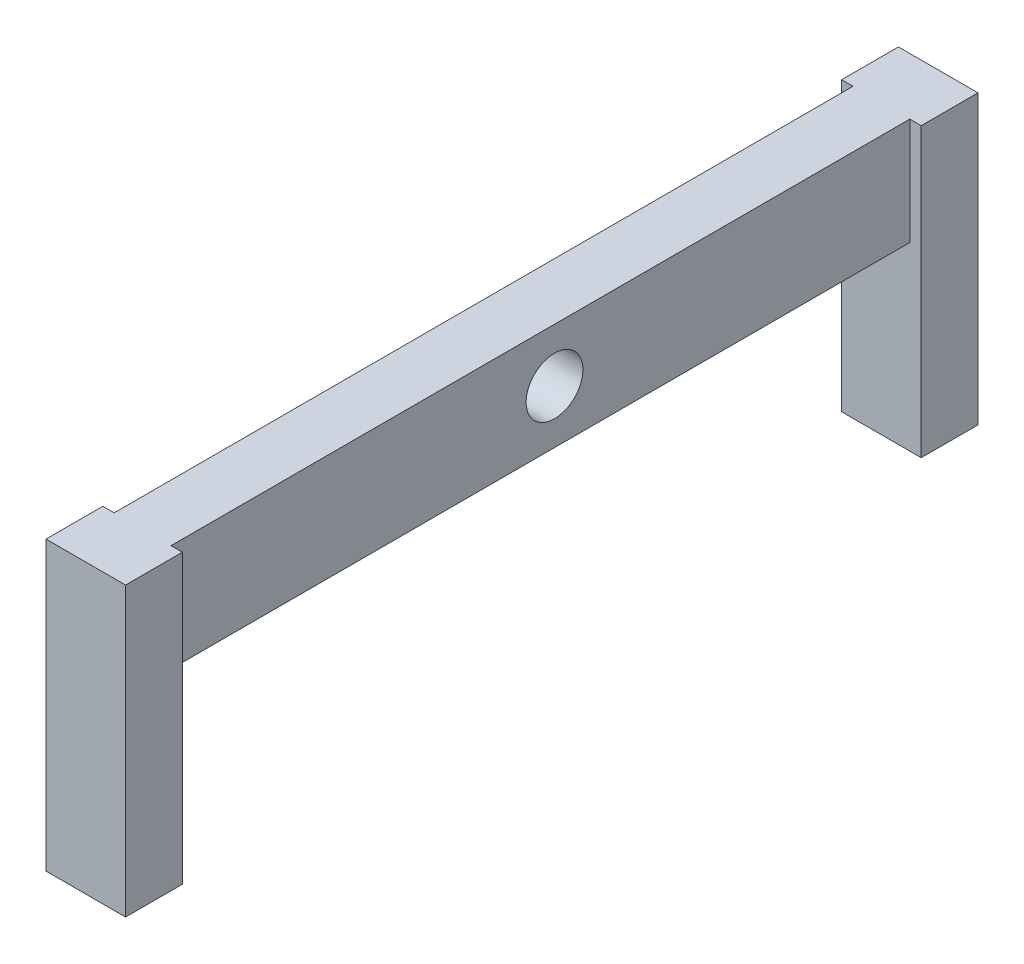
ISO-10303-21;
HEADER;
FILE_DESCRIPTION(('STEP AP214'),'2;1');
FILE_NAME('part.step','',(''),(''),'','','');
FILE_SCHEMA(('AUTOMOTIVE_DESIGN { 1 0 10303 214 1 1 1 1 }'));
ENDSEC;
DATA;
#1=APPLICATION_CONTEXT('core data for automotive mechanical design processes');
#2=APPLICATION_PROTOCOL_DEFINITION('international standard','automotive_design',2000,#1);
#3=PRODUCT_CONTEXT('',#1,'mechanical');
#4=PRODUCT('Part','Part','',(#3));
#5=PRODUCT_RELATED_PRODUCT_CATEGORY('part','',(#4));
#6=PRODUCT_DEFINITION_FORMATION('','',#4);
#7=PRODUCT_DEFINITION_CONTEXT('part definition',#1,'design');
#8=PRODUCT_DEFINITION('design','',#6,#7);
#9=PRODUCT_DEFINITION_SHAPE('','',#8);
#10=(LENGTH_UNIT() NAMED_UNIT(*) SI_UNIT(.MILLI.,.METRE.));
#11=(NAMED_UNIT(*) PLANE_ANGLE_UNIT() SI_UNIT($,.RADIAN.));
#12=(NAMED_UNIT(*) SI_UNIT($,.STERADIAN.) SOLID_ANGLE_UNIT());
#13=UNCERTAINTY_MEASURE_WITH_UNIT(LENGTH_MEASURE(1.E-05),#10,'distance_accuracy_value','');
#14=(GEOMETRIC_REPRESENTATION_CONTEXT(3) GLOBAL_UNCERTAINTY_ASSIGNED_CONTEXT((#13)) GLOBAL_UNIT_ASSIGNED_CONTEXT((#10,
#11,#12)) REPRESENTATION_CONTEXT('',''));
#15=CARTESIAN_POINT('',(0.,0.,0.));
#16=DIRECTION('',(0.,0.,1.));
#17=DIRECTION('',(1.,0.,0.));
#18=AXIS2_PLACEMENT_3D('',#15,#16,#17);
#19=CARTESIAN_POINT('',(-474.137931034483,94.,-241.163793103448));
#20=DIRECTION('',(1.,0.,0.));
#21=DIRECTION('',(0.,0.,-1.));
#22=AXIS2_PLACEMENT_3D('',#19,#20,#21);
#23=PLANE('',#22);
#24=CARTESIAN_POINT('',(-474.137931034483,47.,121.436206896552));
#25=DIRECTION('',(1.,0.,0.));
#26=DIRECTION('',(0.,0.,-1.));
#27=AXIS2_PLACEMENT_3D('',#24,#25,#26);
#28=CIRCLE('',#27,25.);
#29=CARTESIAN_POINT('',(-474.137931034483,47.,96.4362068965518));
#30=VERTEX_POINT('',#29);
#31=EDGE_CURVE('E282',#30,#30,#28,.T.);
#32=ORIENTED_EDGE('',*,*,#31,.T.);
#33=EDGE_LOOP('',(#32));
#34=FACE_BOUND('',#33,.T.);
#35=CARTESIAN_POINT('',(-474.137931034483,47.,405.336206896552));
#36=DIRECTION('',(-1.,0.,0.));
#37=DIRECTION('',(0.,0.,1.));
#38=AXIS2_PLACEMENT_3D('',#35,#36,#37);
#39=CIRCLE('',#38,20.);
#40=CARTESIAN_POINT('',(-474.137931034483,47.,425.336206896552));
#41=VERTEX_POINT('',#40);
#42=EDGE_CURVE('E286',#41,#41,#39,.T.);
#43=ORIENTED_EDGE('',*,*,#42,.F.);
#44=EDGE_LOOP('',(#43));
#45=FACE_BOUND('',#44,.T.);
#46=CARTESIAN_POINT('',(-474.137931034483,47.,-137.663793103448));
#47=DIRECTION('',(-1.,0.,0.));
#48=DIRECTION('',(0.,0.,1.));
#49=AXIS2_PLACEMENT_3D('',#46,#47,#48);
#50=CIRCLE('',#49,20.);
#51=CARTESIAN_POINT('',(-474.137931034483,47.,-117.663793103448));
#52=VERTEX_POINT('',#51);
#53=EDGE_CURVE('E289',#52,#52,#50,.T.);
#54=ORIENTED_EDGE('',*,*,#53,.F.);
#55=EDGE_LOOP('',(#54));
#56=FACE_BOUND('',#55,.T.);
#57=DIRECTION('',(0.,1.,0.));
#58=VECTOR('',#57,1.);
#59=CARTESIAN_POINT('',(-474.137931034483,94.,-191.163793103448));
#60=LINE('',#59,#58);
#61=CARTESIAN_POINT('',(-474.137931034483,0.,-191.163793103448));
#62=VERTEX_POINT('',#61);
#63=CARTESIAN_POINT('',(-474.137931034483,94.,-191.163793103448));
#64=VERTEX_POINT('',#63);
#65=EDGE_CURVE('E210',#62,#64,#60,.T.);
#66=ORIENTED_EDGE('',*,*,#65,.F.);
#67=DIRECTION('',(0.,0.,1.));
#68=VECTOR('',#67,1.);
#69=CARTESIAN_POINT('',(-474.137931034483,0.,-241.163793103448));
#70=LINE('',#69,#68);
#71=CARTESIAN_POINT('',(-474.137931034483,0.,458.836206896552));
#72=VERTEX_POINT('',#71);
#73=EDGE_CURVE('E212',#62,#72,#70,.T.);
#74=ORIENTED_EDGE('',*,*,#73,.T.);
#75=DIRECTION('',(0.,1.,0.));
#76=VECTOR('',#75,1.);
#77=CARTESIAN_POINT('',(-474.137931034483,94.,458.836206896552));
#78=LINE('',#77,#76);
#79=CARTESIAN_POINT('',(-474.137931034483,94.,458.836206896552));
#80=VERTEX_POINT('',#79);
#81=EDGE_CURVE('E56',#72,#80,#78,.T.);
#82=ORIENTED_EDGE('',*,*,#81,.T.);
#83=DIRECTION('',(0.,0.,1.));
#84=VECTOR('',#83,1.);
#85=CARTESIAN_POINT('',(-474.137931034483,94.,-241.163793103448));
#86=LINE('',#85,#84);
#87=EDGE_CURVE('E213',#64,#80,#86,.T.);
#88=ORIENTED_EDGE('',*,*,#87,.F.);
#89=EDGE_LOOP('',(#66,#74,#82,#88));
#90=FACE_BOUND('',#89,.T.);
#91=ADVANCED_FACE('F41',(#34,#45,#56,#90),#23,.F.);
#92=CARTESIAN_POINT('',(-424.137931034483,94.,-241.163793103448));
#93=DIRECTION('',(-1.,0.,0.));
#94=DIRECTION('',(0.,0.,1.));
#95=AXIS2_PLACEMENT_3D('',#92,#93,#94);
#96=PLANE('',#95);
#97=CARTESIAN_POINT('',(-424.137931034483,47.,121.436206896552));
#98=DIRECTION('',(-1.,0.,0.));
#99=DIRECTION('',(0.,0.,1.));
#100=AXIS2_PLACEMENT_3D('',#97,#98,#99);
#101=CIRCLE('',#100,25.);
#102=CARTESIAN_POINT('',(-424.137931034483,47.,146.436206896552));
#103=VERTEX_POINT('',#102);
#104=EDGE_CURVE('E44',#103,#103,#101,.T.);
#105=ORIENTED_EDGE('',*,*,#104,.T.);
#106=EDGE_LOOP('',(#105));
#107=FACE_BOUND('',#106,.T.);
#108=DIRECTION('',(0.,-1.,0.));
#109=VECTOR('',#108,1.);
#110=CARTESIAN_POINT('',(-424.137931034483,94.,-191.163793103448));
#111=LINE('',#110,#109);
#112=CARTESIAN_POINT('',(-424.137931034483,94.,-191.163793103448));
#113=VERTEX_POINT('',#112);
#114=CARTESIAN_POINT('',(-424.137931034483,0.,-191.163793103448));
#115=VERTEX_POINT('',#114);
#116=EDGE_CURVE('E208',#113,#115,#111,.T.);
#117=ORIENTED_EDGE('',*,*,#116,.F.);
#118=DIRECTION('',(0.,0.,-1.));
#119=VECTOR('',#118,1.);
#120=CARTESIAN_POINT('',(-424.137931034483,94.,-241.163793103448));
#121=LINE('',#120,#119);
#122=CARTESIAN_POINT('',(-424.137931034483,94.,458.836206896552));
#123=VERTEX_POINT('',#122);
#124=EDGE_CURVE('E219',#123,#113,#121,.T.);
#125=ORIENTED_EDGE('',*,*,#124,.F.);
#126=DIRECTION('',(0.,-1.,0.));
#127=VECTOR('',#126,1.);
#128=CARTESIAN_POINT('',(-424.137931034483,94.,458.836206896552));
#129=LINE('',#128,#127);
#130=CARTESIAN_POINT('',(-424.137931034483,0.,458.836206896552));
#131=VERTEX_POINT('',#130);
#132=EDGE_CURVE('E167',#123,#131,#129,.T.);
#133=ORIENTED_EDGE('',*,*,#132,.T.);
#134=DIRECTION('',(0.,0.,-1.));
#135=VECTOR('',#134,1.);
#136=CARTESIAN_POINT('',(-424.137931034483,0.,-241.163793103448));
#137=LINE('',#136,#135);
#138=EDGE_CURVE('E217',#131,#115,#137,.T.);
#139=ORIENTED_EDGE('',*,*,#138,.T.);
#140=EDGE_LOOP('',(#117,#125,#133,#139));
#141=FACE_BOUND('',#140,.T.);
#142=ADVANCED_FACE('F246',(#107,#141),#96,.F.);
#143=CARTESIAN_POINT('',(0.,0.,0.));
#144=DIRECTION('',(0.,1.,0.));
#145=DIRECTION('',(0.,0.,1.));
#146=AXIS2_PLACEMENT_3D('',#143,#144,#145);
#147=PLANE('',#146);
#148=DIRECTION('',(-1.,0.,0.));
#149=VECTOR('',#148,1.);
#150=CARTESIAN_POINT('',(0.,0.,-191.163793103448));
#151=LINE('',#150,#149);
#152=EDGE_CURVE('E11',#115,#62,#151,.T.);
#153=ORIENTED_EDGE('',*,*,#152,.F.);
#154=ORIENTED_EDGE('',*,*,#138,.F.);
#155=DIRECTION('',(-1.,0.,0.));
#156=VECTOR('',#155,1.);
#157=CARTESIAN_POINT('',(-7.27729316326035E-13,0.,458.836206896552));
#158=LINE('',#157,#156);
#159=EDGE_CURVE('E49',#131,#72,#158,.T.);
#160=ORIENTED_EDGE('',*,*,#159,.T.);
#161=ORIENTED_EDGE('',*,*,#73,.F.);
#162=EDGE_LOOP('',(#153,#154,#160,#161));
#163=FACE_BOUND('',#162,.T.);
#164=ADVANCED_FACE('F231',(#163),#147,.F.);
#165=CARTESIAN_POINT('',(-474.137931034483,94.,508.836206896552));
#166=DIRECTION('',(0.,0.,-1.));
#167=DIRECTION('',(-1.,0.,0.));
#168=AXIS2_PLACEMENT_3D('',#165,#166,#167);
#169=PLANE('',#168);
#170=DIRECTION('',(1.,0.,0.));
#171=VECTOR('',#170,1.);
#172=CARTESIAN_POINT('',(-474.137931034483,94.,508.836206896552));
#173=LINE('',#172,#171);
#174=CARTESIAN_POINT('',(-484.137931034484,94.,508.836206896552));
#175=VERTEX_POINT('',#174);
#176=CARTESIAN_POINT('',(-414.137931034484,94.,508.836206896552));
#177=VERTEX_POINT('',#176);
#178=EDGE_CURVE('E216',#175,#177,#173,.T.);
#179=ORIENTED_EDGE('',*,*,#178,.F.);
#180=DIRECTION('',(0.,1.,0.));
#181=VECTOR('',#180,1.);
#182=CARTESIAN_POINT('',(-484.137931034484,-159.,508.836206896552));
#183=LINE('',#182,#181);
#184=CARTESIAN_POINT('',(-484.137931034484,-159.,508.836206896552));
#185=VERTEX_POINT('',#184);
#186=EDGE_CURVE('E195',#185,#175,#183,.T.);
#187=ORIENTED_EDGE('',*,*,#186,.F.);
#188=DIRECTION('',(-1.,0.,0.));
#189=VECTOR('',#188,1.);
#190=CARTESIAN_POINT('',(0.,-159.,508.836206896552));
#191=LINE('',#190,#189);
#192=CARTESIAN_POINT('',(-414.137931034484,-159.,508.836206896552));
#193=VERTEX_POINT('',#192);
#194=EDGE_CURVE('E172',#193,#185,#191,.T.);
#195=ORIENTED_EDGE('',*,*,#194,.F.);
#196=DIRECTION('',(0.,1.,0.));
#197=VECTOR('',#196,1.);
#198=CARTESIAN_POINT('',(-414.137931034484,-159.,508.836206896552));
#199=LINE('',#198,#197);
#200=EDGE_CURVE('E184',#193,#177,#199,.T.);
#201=ORIENTED_EDGE('',*,*,#200,.T.);
#202=EDGE_LOOP('',(#179,#187,#195,#201));
#203=FACE_BOUND('',#202,.T.);
#204=ADVANCED_FACE('F263',(#203),#169,.F.);
#205=CARTESIAN_POINT('',(-474.137931034483,94.,-241.163793103448));
#206=DIRECTION('',(0.,0.,1.));
#207=DIRECTION('',(1.,0.,0.));
#208=AXIS2_PLACEMENT_3D('',#205,#206,#207);
#209=PLANE('',#208);
#210=DIRECTION('',(-1.,0.,0.));
#211=VECTOR('',#210,1.);
#212=CARTESIAN_POINT('',(-474.137931034483,94.,-241.163793103448));
#213=LINE('',#212,#211);
#214=CARTESIAN_POINT('',(-414.137931034483,94.,-241.163793103448));
#215=VERTEX_POINT('',#214);
#216=CARTESIAN_POINT('',(-484.137931034483,94.,-241.163793103448));
#217=VERTEX_POINT('',#216);
#218=EDGE_CURVE('E222',#215,#217,#213,.T.);
#219=ORIENTED_EDGE('',*,*,#218,.F.);
#220=DIRECTION('',(0.,1.,0.));
#221=VECTOR('',#220,1.);
#222=CARTESIAN_POINT('',(-414.137931034483,-159.,-241.163793103448));
#223=LINE('',#222,#221);
#224=CARTESIAN_POINT('',(-414.137931034483,-159.,-241.163793103448));
#225=VERTEX_POINT('',#224);
#226=EDGE_CURVE('E146',#225,#215,#223,.T.);
#227=ORIENTED_EDGE('',*,*,#226,.F.);
#228=DIRECTION('',(-1.,0.,0.));
#229=VECTOR('',#228,1.);
#230=CARTESIAN_POINT('',(0.,-159.,-241.163793103448));
#231=LINE('',#230,#229);
#232=CARTESIAN_POINT('',(-484.137931034483,-159.,-241.163793103448));
#233=VERTEX_POINT('',#232);
#234=EDGE_CURVE('E136',#225,#233,#231,.T.);
#235=ORIENTED_EDGE('',*,*,#234,.T.);
#236=DIRECTION('',(0.,1.,0.));
#237=VECTOR('',#236,1.);
#238=CARTESIAN_POINT('',(-484.137931034483,-159.,-241.163793103448));
#239=LINE('',#238,#237);
#240=EDGE_CURVE('E168',#233,#217,#239,.T.);
#241=ORIENTED_EDGE('',*,*,#240,.T.);
#242=EDGE_LOOP('',(#219,#227,#235,#241));
#243=FACE_BOUND('',#242,.T.);
#244=ADVANCED_FACE('F242',(#243),#209,.F.);
#245=CARTESIAN_POINT('',(0.,94.,0.));
#246=DIRECTION('',(0.,1.,0.));
#247=DIRECTION('',(0.,0.,1.));
#248=AXIS2_PLACEMENT_3D('',#245,#246,#247);
#249=PLANE('',#248);
#250=ORIENTED_EDGE('',*,*,#218,.T.);
#251=DIRECTION('',(0.,0.,-1.));
#252=VECTOR('',#251,1.);
#253=CARTESIAN_POINT('',(-484.137931034483,94.,0.));
#254=LINE('',#253,#252);
#255=CARTESIAN_POINT('',(-484.137931034483,94.,-191.163793103448));
#256=VERTEX_POINT('',#255);
#257=EDGE_CURVE('E152',#256,#217,#254,.T.);
#258=ORIENTED_EDGE('',*,*,#257,.F.);
#259=DIRECTION('',(-1.,0.,0.));
#260=VECTOR('',#259,1.);
#261=CARTESIAN_POINT('',(0.,94.,-191.163793103448));
#262=LINE('',#261,#260);
#263=EDGE_CURVE('E164',#64,#256,#262,.T.);
#264=ORIENTED_EDGE('',*,*,#263,.F.);
#265=ORIENTED_EDGE('',*,*,#87,.T.);
#266=DIRECTION('',(-1.,0.,0.));
#267=VECTOR('',#266,1.);
#268=CARTESIAN_POINT('',(-7.27729316326035E-13,94.,458.836206896552));
#269=LINE('',#268,#267);
#270=CARTESIAN_POINT('',(-484.137931034484,94.,458.836206896552));
#271=VERTEX_POINT('',#270);
#272=EDGE_CURVE('E188',#80,#271,#269,.T.);
#273=ORIENTED_EDGE('',*,*,#272,.T.);
#274=DIRECTION('',(0.,0.,1.));
#275=VECTOR('',#274,1.);
#276=CARTESIAN_POINT('',(-484.137931034483,94.,-1.07500215625774E-12));
#277=LINE('',#276,#275);
#278=EDGE_CURVE('E175',#271,#175,#277,.T.);
#279=ORIENTED_EDGE('',*,*,#278,.T.);
#280=ORIENTED_EDGE('',*,*,#178,.T.);
#281=DIRECTION('',(0.,0.,-1.));
#282=VECTOR('',#281,1.);
#283=CARTESIAN_POINT('',(-414.137931034483,94.,-9.19570932810217E-13));
#284=LINE('',#283,#282);
#285=CARTESIAN_POINT('',(-414.137931034484,94.,458.836206896552));
#286=VERTEX_POINT('',#285);
#287=EDGE_CURVE('E185',#177,#286,#284,.T.);
#288=ORIENTED_EDGE('',*,*,#287,.T.);
#289=EDGE_CURVE('E190',#286,#123,#269,.T.);
#290=ORIENTED_EDGE('',*,*,#289,.T.);
#291=ORIENTED_EDGE('',*,*,#124,.T.);
#292=CARTESIAN_POINT('',(-414.137931034483,94.,-191.163793103448));
#293=VERTEX_POINT('',#292);
#294=EDGE_CURVE('E162',#293,#113,#262,.T.);
#295=ORIENTED_EDGE('',*,*,#294,.F.);
#296=DIRECTION('',(0.,0.,1.));
#297=VECTOR('',#296,1.);
#298=CARTESIAN_POINT('',(-414.137931034483,94.,0.));
#299=LINE('',#298,#297);
#300=EDGE_CURVE('E144',#215,#293,#299,.T.);
#301=ORIENTED_EDGE('',*,*,#300,.F.);
#302=EDGE_LOOP('',(#250,#258,#264,#265,#273,#279,#280,#288,#290,#291,#295,#301));
#303=FACE_BOUND('',#302,.T.);
#304=ADVANCED_FACE('F237',(#303),#249,.T.);
#305=CARTESIAN_POINT('',(-7.27729316326035E-13,-159.,458.836206896552));
#306=DIRECTION('',(0.,0.,-1.));
#307=DIRECTION('',(-1.,0.,0.));
#308=AXIS2_PLACEMENT_3D('',#305,#306,#307);
#309=PLANE('',#308);
#310=ORIENTED_EDGE('',*,*,#81,.F.);
#311=ORIENTED_EDGE('',*,*,#159,.F.);
#312=ORIENTED_EDGE('',*,*,#132,.F.);
#313=ORIENTED_EDGE('',*,*,#289,.F.);
#314=DIRECTION('',(0.,1.,0.));
#315=VECTOR('',#314,1.);
#316=CARTESIAN_POINT('',(-414.137931034484,-159.,458.836206896552));
#317=LINE('',#316,#315);
#318=CARTESIAN_POINT('',(-414.137931034484,-159.,458.836206896552));
#319=VERTEX_POINT('',#318);
#320=EDGE_CURVE('E201',#319,#286,#317,.T.);
#321=ORIENTED_EDGE('',*,*,#320,.F.);
#322=DIRECTION('',(-1.,0.,0.));
#323=VECTOR('',#322,1.);
#324=CARTESIAN_POINT('',(-7.27729316326035E-13,-159.,458.836206896552));
#325=LINE('',#324,#323);
#326=CARTESIAN_POINT('',(-484.137931034484,-159.,458.836206896552));
#327=VERTEX_POINT('',#326);
#328=EDGE_CURVE('E178',#319,#327,#325,.T.);
#329=ORIENTED_EDGE('',*,*,#328,.T.);
#330=DIRECTION('',(0.,1.,0.));
#331=VECTOR('',#330,1.);
#332=CARTESIAN_POINT('',(-484.137931034484,-159.,458.836206896552));
#333=LINE('',#332,#331);
#334=EDGE_CURVE('E198',#327,#271,#333,.T.);
#335=ORIENTED_EDGE('',*,*,#334,.T.);
#336=ORIENTED_EDGE('',*,*,#272,.F.);
#337=EDGE_LOOP('',(#310,#311,#312,#313,#321,#329,#335,#336));
#338=FACE_BOUND('',#337,.T.);
#339=ADVANCED_FACE('F248',(#338),#309,.T.);
#340=CARTESIAN_POINT('',(-484.137931034483,-159.,-1.07500215625774E-12));
#341=DIRECTION('',(-1.,0.,0.));
#342=DIRECTION('',(0.,0.,1.));
#343=AXIS2_PLACEMENT_3D('',#340,#341,#342);
#344=PLANE('',#343);
#345=ORIENTED_EDGE('',*,*,#278,.F.);
#346=ORIENTED_EDGE('',*,*,#334,.F.);
#347=DIRECTION('',(0.,0.,1.));
#348=VECTOR('',#347,1.);
#349=CARTESIAN_POINT('',(-484.137931034483,-159.,-1.07500215625774E-12));
#350=LINE('',#349,#348);
#351=EDGE_CURVE('E181',#327,#185,#350,.T.);
#352=ORIENTED_EDGE('',*,*,#351,.T.);
#353=ORIENTED_EDGE('',*,*,#186,.T.);
#354=EDGE_LOOP('',(#345,#346,#352,#353));
#355=FACE_BOUND('',#354,.T.);
#356=ADVANCED_FACE('F261',(#355),#344,.T.);
#357=CARTESIAN_POINT('',(-414.137931034483,-159.,-9.19570932810217E-13));
#358=DIRECTION('',(1.,0.,0.));
#359=DIRECTION('',(0.,0.,-1.));
#360=AXIS2_PLACEMENT_3D('',#357,#358,#359);
#361=PLANE('',#360);
#362=ORIENTED_EDGE('',*,*,#287,.F.);
#363=ORIENTED_EDGE('',*,*,#200,.F.);
#364=DIRECTION('',(0.,0.,-1.));
#365=VECTOR('',#364,1.);
#366=CARTESIAN_POINT('',(-414.137931034483,-159.,-9.19570932810217E-13));
#367=LINE('',#366,#365);
#368=EDGE_CURVE('E174',#193,#319,#367,.T.);
#369=ORIENTED_EDGE('',*,*,#368,.T.);
#370=ORIENTED_EDGE('',*,*,#320,.T.);
#371=EDGE_LOOP('',(#362,#363,#369,#370));
#372=FACE_BOUND('',#371,.T.);
#373=ADVANCED_FACE('F251',(#372),#361,.T.);
#374=CARTESIAN_POINT('',(0.,-159.,0.));
#375=DIRECTION('',(0.,1.,0.));
#376=DIRECTION('',(0.,0.,1.));
#377=AXIS2_PLACEMENT_3D('',#374,#375,#376);
#378=PLANE('',#377);
#379=ORIENTED_EDGE('',*,*,#194,.T.);
#380=ORIENTED_EDGE('',*,*,#351,.F.);
#381=ORIENTED_EDGE('',*,*,#328,.F.);
#382=ORIENTED_EDGE('',*,*,#368,.F.);
#383=EDGE_LOOP('',(#379,#380,#381,#382));
#384=FACE_BOUND('',#383,.T.);
#385=ADVANCED_FACE('F257',(#384),#378,.F.);
#386=CARTESIAN_POINT('',(0.,-159.,-191.163793103448));
#387=DIRECTION('',(0.,0.,-1.));
#388=DIRECTION('',(-1.,0.,0.));
#389=AXIS2_PLACEMENT_3D('',#386,#387,#388);
#390=PLANE('',#389);
#391=ORIENTED_EDGE('',*,*,#152,.T.);
#392=ORIENTED_EDGE('',*,*,#65,.T.);
#393=ORIENTED_EDGE('',*,*,#263,.T.);
#394=DIRECTION('',(0.,1.,0.));
#395=VECTOR('',#394,1.);
#396=CARTESIAN_POINT('',(-484.137931034483,-159.,-191.163793103448));
#397=LINE('',#396,#395);
#398=CARTESIAN_POINT('',(-484.137931034483,-159.,-191.163793103448));
#399=VERTEX_POINT('',#398);
#400=EDGE_CURVE('E151',#399,#256,#397,.T.);
#401=ORIENTED_EDGE('',*,*,#400,.F.);
#402=DIRECTION('',(-1.,0.,0.));
#403=VECTOR('',#402,1.);
#404=CARTESIAN_POINT('',(0.,-159.,-191.163793103448));
#405=LINE('',#404,#403);
#406=CARTESIAN_POINT('',(-414.137931034483,-159.,-191.163793103448));
#407=VERTEX_POINT('',#406);
#408=EDGE_CURVE('E133',#407,#399,#405,.T.);
#409=ORIENTED_EDGE('',*,*,#408,.F.);
#410=DIRECTION('',(0.,1.,0.));
#411=VECTOR('',#410,1.);
#412=CARTESIAN_POINT('',(-414.137931034483,-159.,-191.163793103448));
#413=LINE('',#412,#411);
#414=EDGE_CURVE('E141',#407,#293,#413,.T.);
#415=ORIENTED_EDGE('',*,*,#414,.T.);
#416=ORIENTED_EDGE('',*,*,#294,.T.);
#417=ORIENTED_EDGE('',*,*,#116,.T.);
#418=EDGE_LOOP('',(#391,#392,#393,#401,#409,#415,#416,#417));
#419=FACE_BOUND('',#418,.T.);
#420=ADVANCED_FACE('F149',(#419),#390,.F.);
#421=CARTESIAN_POINT('',(-484.137931034483,-159.,0.));
#422=DIRECTION('',(1.,0.,0.));
#423=DIRECTION('',(0.,0.,-1.));
#424=AXIS2_PLACEMENT_3D('',#421,#422,#423);
#425=PLANE('',#424);
#426=ORIENTED_EDGE('',*,*,#257,.T.);
#427=ORIENTED_EDGE('',*,*,#240,.F.);
#428=DIRECTION('',(0.,0.,-1.));
#429=VECTOR('',#428,1.);
#430=CARTESIAN_POINT('',(-484.137931034483,-159.,0.));
#431=LINE('',#430,#429);
#432=EDGE_CURVE('E147',#399,#233,#431,.T.);
#433=ORIENTED_EDGE('',*,*,#432,.F.);
#434=ORIENTED_EDGE('',*,*,#400,.T.);
#435=EDGE_LOOP('',(#426,#427,#433,#434));
#436=FACE_BOUND('',#435,.T.);
#437=ADVANCED_FACE('F240',(#436),#425,.F.);
#438=CARTESIAN_POINT('',(-414.137931034483,-159.,0.));
#439=DIRECTION('',(-1.,0.,0.));
#440=DIRECTION('',(0.,0.,1.));
#441=AXIS2_PLACEMENT_3D('',#438,#439,#440);
#442=PLANE('',#441);
#443=ORIENTED_EDGE('',*,*,#300,.T.);
#444=ORIENTED_EDGE('',*,*,#414,.F.);
#445=DIRECTION('',(0.,0.,1.));
#446=VECTOR('',#445,1.);
#447=CARTESIAN_POINT('',(-414.137931034483,-159.,0.));
#448=LINE('',#447,#446);
#449=EDGE_CURVE('E129',#225,#407,#448,.T.);
#450=ORIENTED_EDGE('',*,*,#449,.F.);
#451=ORIENTED_EDGE('',*,*,#226,.T.);
#452=EDGE_LOOP('',(#443,#444,#450,#451));
#453=FACE_BOUND('',#452,.T.);
#454=ADVANCED_FACE('F142',(#453),#442,.F.);
#455=CARTESIAN_POINT('',(0.,-159.,0.));
#456=DIRECTION('',(0.,1.,0.));
#457=DIRECTION('',(0.,0.,1.));
#458=AXIS2_PLACEMENT_3D('',#455,#456,#457);
#459=PLANE('',#458);
#460=ORIENTED_EDGE('',*,*,#408,.T.);
#461=ORIENTED_EDGE('',*,*,#432,.T.);
#462=ORIENTED_EDGE('',*,*,#234,.F.);
#463=ORIENTED_EDGE('',*,*,#449,.T.);
#464=EDGE_LOOP('',(#460,#461,#462,#463));
#465=FACE_BOUND('',#464,.T.);
#466=ADVANCED_FACE('F131',(#465),#459,.F.);
#467=CARTESIAN_POINT('',(-464.137931034483,47.,-137.663793103448));
#468=DIRECTION('',(-1.,0.,0.));
#469=DIRECTION('',(0.,0.,1.));
#470=AXIS2_PLACEMENT_3D('',#467,#468,#469);
#471=CYLINDRICAL_SURFACE('',#470,20.);
#472=CARTESIAN_POINT('',(-464.137931034483,47.,-137.663793103448));
#473=DIRECTION('',(-1.,0.,0.));
#474=DIRECTION('',(0.,0.,1.));
#475=AXIS2_PLACEMENT_3D('',#472,#473,#474);
#476=CIRCLE('',#475,20.);
#477=CARTESIAN_POINT('',(-464.137931034483,47.,-117.663793103448));
#478=VERTEX_POINT('',#477);
#479=EDGE_CURVE('E157',#478,#478,#476,.T.);
#480=ORIENTED_EDGE('',*,*,#479,.F.);
#481=EDGE_LOOP('',(#480));
#482=FACE_BOUND('',#481,.T.);
#483=ORIENTED_EDGE('',*,*,#53,.T.);
#484=EDGE_LOOP('',(#483));
#485=FACE_BOUND('',#484,.T.);
#486=ADVANCED_FACE('F314',(#482,#485),#471,.F.);
#487=CARTESIAN_POINT('',(-464.137931034483,47.,-137.663793103448));
#488=DIRECTION('',(-1.,0.,0.));
#489=DIRECTION('',(0.,0.,1.));
#490=AXIS2_PLACEMENT_3D('',#487,#488,#489);
#491=PLANE('',#490);
#492=ORIENTED_EDGE('',*,*,#479,.T.);
#493=EDGE_LOOP('',(#492));
#494=FACE_BOUND('',#493,.T.);
#495=ADVANCED_FACE('F312',(#494),#491,.T.);
#496=CARTESIAN_POINT('',(-464.137931034483,47.,405.336206896552));
#497=DIRECTION('',(-1.,0.,0.));
#498=DIRECTION('',(0.,0.,1.));
#499=AXIS2_PLACEMENT_3D('',#496,#497,#498);
#500=CYLINDRICAL_SURFACE('',#499,20.);
#501=CARTESIAN_POINT('',(-464.137931034483,47.,405.336206896552));
#502=DIRECTION('',(-1.,0.,0.));
#503=DIRECTION('',(0.,0.,1.));
#504=AXIS2_PLACEMENT_3D('',#501,#502,#503);
#505=CIRCLE('',#504,20.);
#506=CARTESIAN_POINT('',(-464.137931034483,47.,425.336206896552));
#507=VERTEX_POINT('',#506);
#508=EDGE_CURVE('E189',#507,#507,#505,.T.);
#509=ORIENTED_EDGE('',*,*,#508,.F.);
#510=EDGE_LOOP('',(#509));
#511=FACE_BOUND('',#510,.T.);
#512=ORIENTED_EDGE('',*,*,#42,.T.);
#513=EDGE_LOOP('',(#512));
#514=FACE_BOUND('',#513,.T.);
#515=ADVANCED_FACE('F306',(#511,#514),#500,.F.);
#516=CARTESIAN_POINT('',(-464.137931034483,47.,405.336206896552));
#517=DIRECTION('',(-1.,0.,0.));
#518=DIRECTION('',(0.,0.,1.));
#519=AXIS2_PLACEMENT_3D('',#516,#517,#518);
#520=PLANE('',#519);
#521=ORIENTED_EDGE('',*,*,#508,.T.);
#522=EDGE_LOOP('',(#521));
#523=FACE_BOUND('',#522,.T.);
#524=ADVANCED_FACE('F302',(#523),#520,.T.);
#525=CARTESIAN_POINT('',(-484.137931034484,47.,121.436206896552));
#526=DIRECTION('',(1.,0.,0.));
#527=DIRECTION('',(0.,0.,-1.));
#528=AXIS2_PLACEMENT_3D('',#525,#526,#527);
#529=CYLINDRICAL_SURFACE('',#528,25.);
#530=ORIENTED_EDGE('',*,*,#104,.F.);
#531=EDGE_LOOP('',(#530));
#532=FACE_BOUND('',#531,.T.);
#533=ORIENTED_EDGE('',*,*,#31,.F.);
#534=EDGE_LOOP('',(#533));
#535=FACE_BOUND('',#534,.T.);
#536=ADVANCED_FACE('F299',(#532,#535),#529,.F.);
#537=CLOSED_SHELL('',(#91,#142,#164,#204,#244,#304,#339,#356,#373,#385,#420,#437,#454,#466,#486,
#495,#515,#524,#536));
#538=MANIFOLD_SOLID_BREP('B2',#537);
#539=ADVANCED_BREP_SHAPE_REPRESENTATION('',(#18,#538),#14);
#540=SHAPE_DEFINITION_REPRESENTATION(#9,#539);
ENDSEC;
END-ISO-10303-21;
